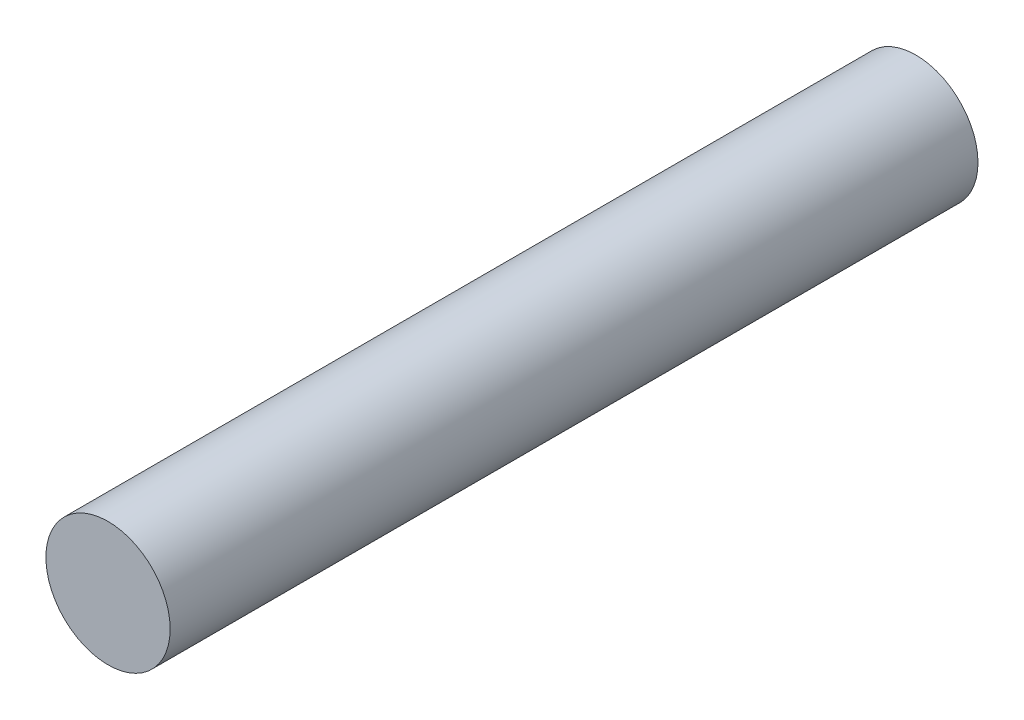
ISO-10303-21;
HEADER;
FILE_DESCRIPTION(('STEP AP214'),'2;1');
FILE_NAME('part.step','',(''),(''),'','','');
FILE_SCHEMA(('AUTOMOTIVE_DESIGN { 1 0 10303 214 1 1 1 1 }'));
ENDSEC;
DATA;
#1=APPLICATION_CONTEXT('core data for automotive mechanical design processes');
#2=APPLICATION_PROTOCOL_DEFINITION('international standard','automotive_design',2000,#1);
#3=PRODUCT_CONTEXT('',#1,'mechanical');
#4=PRODUCT('Part','Part','',(#3));
#5=PRODUCT_RELATED_PRODUCT_CATEGORY('part','',(#4));
#6=PRODUCT_DEFINITION_FORMATION('','',#4);
#7=PRODUCT_DEFINITION_CONTEXT('part definition',#1,'design');
#8=PRODUCT_DEFINITION('design','',#6,#7);
#9=PRODUCT_DEFINITION_SHAPE('','',#8);
#10=(LENGTH_UNIT() NAMED_UNIT(*) SI_UNIT(.MILLI.,.METRE.));
#11=(NAMED_UNIT(*) PLANE_ANGLE_UNIT() SI_UNIT($,.RADIAN.));
#12=(NAMED_UNIT(*) SI_UNIT($,.STERADIAN.) SOLID_ANGLE_UNIT());
#13=UNCERTAINTY_MEASURE_WITH_UNIT(LENGTH_MEASURE(1.E-05),#10,'distance_accuracy_value','');
#14=(GEOMETRIC_REPRESENTATION_CONTEXT(3) GLOBAL_UNCERTAINTY_ASSIGNED_CONTEXT((#13)) GLOBAL_UNIT_ASSIGNED_CONTEXT((#10,
#11,#12)) REPRESENTATION_CONTEXT('',''));
#15=CARTESIAN_POINT('',(0.,0.,0.));
#16=DIRECTION('',(0.,0.,1.));
#17=DIRECTION('',(1.,0.,0.));
#18=AXIS2_PLACEMENT_3D('',#15,#16,#17);
#19=CARTESIAN_POINT('',(0.,0.,65.));
#20=DIRECTION('',(0.,0.,-1.));
#21=DIRECTION('',(-1.,0.,0.));
#22=AXIS2_PLACEMENT_3D('',#19,#20,#21);
#23=CYLINDRICAL_SURFACE('',#22,5.);
#24=CARTESIAN_POINT('',(0.,0.,65.));
#25=DIRECTION('',(0.,0.,1.));
#26=DIRECTION('',(1.,0.,0.));
#27=AXIS2_PLACEMENT_3D('',#24,#25,#26);
#28=CIRCLE('',#27,5.);
#29=CARTESIAN_POINT('',(5.,0.,65.));
#30=VERTEX_POINT('',#29);
#31=EDGE_CURVE('E10',#30,#30,#28,.T.);
#32=ORIENTED_EDGE('',*,*,#31,.F.);
#33=EDGE_LOOP('',(#32));
#34=FACE_BOUND('',#33,.T.);
#35=CARTESIAN_POINT('',(0.,0.,0.));
#36=DIRECTION('',(0.,0.,1.));
#37=DIRECTION('',(1.,0.,0.));
#38=AXIS2_PLACEMENT_3D('',#35,#36,#37);
#39=CIRCLE('',#38,5.);
#40=CARTESIAN_POINT('',(5.,0.,0.));
#41=VERTEX_POINT('',#40);
#42=EDGE_CURVE('E34',#41,#41,#39,.T.);
#43=ORIENTED_EDGE('',*,*,#42,.T.);
#44=EDGE_LOOP('',(#43));
#45=FACE_BOUND('',#44,.T.);
#46=ADVANCED_FACE('F31',(#34,#45),#23,.T.);
#47=CARTESIAN_POINT('',(0.,0.,65.));
#48=DIRECTION('',(0.,0.,1.));
#49=DIRECTION('',(1.,0.,0.));
#50=AXIS2_PLACEMENT_3D('',#47,#48,#49);
#51=PLANE('',#50);
#52=ORIENTED_EDGE('',*,*,#31,.T.);
#53=EDGE_LOOP('',(#52));
#54=FACE_BOUND('',#53,.T.);
#55=ADVANCED_FACE('F46',(#54),#51,.T.);
#56=CARTESIAN_POINT('',(0.,0.,0.));
#57=DIRECTION('',(0.,0.,1.));
#58=DIRECTION('',(1.,0.,0.));
#59=AXIS2_PLACEMENT_3D('',#56,#57,#58);
#60=PLANE('',#59);
#61=ORIENTED_EDGE('',*,*,#42,.F.);
#62=EDGE_LOOP('',(#61));
#63=FACE_BOUND('',#62,.T.);
#64=ADVANCED_FACE('F44',(#63),#60,.F.);
#65=CLOSED_SHELL('',(#46,#55,#64));
#66=MANIFOLD_SOLID_BREP('B2',#65);
#67=ADVANCED_BREP_SHAPE_REPRESENTATION('',(#18,#66),#14);
#68=SHAPE_DEFINITION_REPRESENTATION(#9,#67);
ENDSEC;
END-ISO-10303-21;
